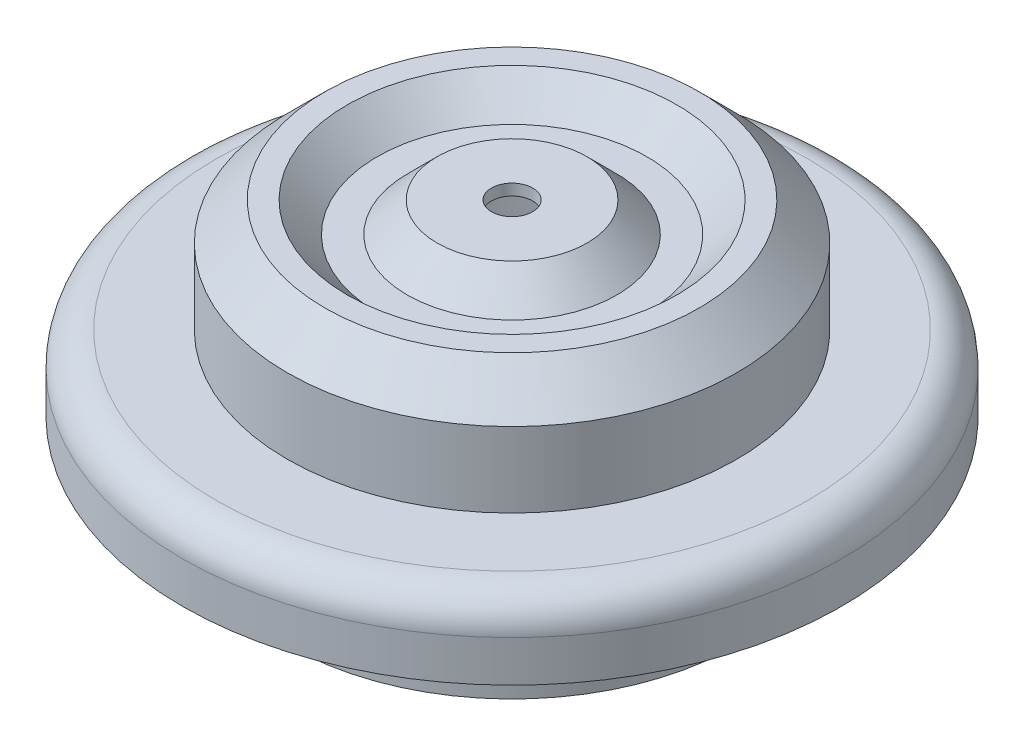
ISO-10303-21;
HEADER;
FILE_DESCRIPTION(('STEP AP214'),'2;1');
FILE_NAME('part.step','',(''),(''),'','','');
FILE_SCHEMA(('AUTOMOTIVE_DESIGN { 1 0 10303 214 1 1 1 1 }'));
ENDSEC;
DATA;
#1=APPLICATION_CONTEXT('core data for automotive mechanical design processes');
#2=APPLICATION_PROTOCOL_DEFINITION('international standard','automotive_design',2000,#1);
#3=PRODUCT_CONTEXT('',#1,'mechanical');
#4=PRODUCT('Part','Part','',(#3));
#5=PRODUCT_RELATED_PRODUCT_CATEGORY('part','',(#4));
#6=PRODUCT_DEFINITION_FORMATION('','',#4);
#7=PRODUCT_DEFINITION_CONTEXT('part definition',#1,'design');
#8=PRODUCT_DEFINITION('design','',#6,#7);
#9=PRODUCT_DEFINITION_SHAPE('','',#8);
#10=(LENGTH_UNIT() NAMED_UNIT(*) SI_UNIT(.MILLI.,.METRE.));
#11=(NAMED_UNIT(*) PLANE_ANGLE_UNIT() SI_UNIT($,.RADIAN.));
#12=(NAMED_UNIT(*) SI_UNIT($,.STERADIAN.) SOLID_ANGLE_UNIT());
#13=UNCERTAINTY_MEASURE_WITH_UNIT(LENGTH_MEASURE(1.E-05),#10,'distance_accuracy_value','');
#14=(GEOMETRIC_REPRESENTATION_CONTEXT(3) GLOBAL_UNCERTAINTY_ASSIGNED_CONTEXT((#13)) GLOBAL_UNIT_ASSIGNED_CONTEXT((#10,
#11,#12)) REPRESENTATION_CONTEXT('',''));
#15=CARTESIAN_POINT('',(0.,0.,0.));
#16=DIRECTION('',(0.,0.,1.));
#17=DIRECTION('',(1.,0.,0.));
#18=AXIS2_PLACEMENT_3D('',#15,#16,#17);
#19=CARTESIAN_POINT('',(28.5,-16.5,0.));
#20=DIRECTION('',(0.,1.,0.));
#21=DIRECTION('',(0.,0.,1.));
#22=AXIS2_PLACEMENT_3D('',#19,#20,#21);
#23=PLANE('',#22);
#24=CARTESIAN_POINT('',(0.,-16.5,0.));
#25=DIRECTION('',(0.,1.,0.));
#26=DIRECTION('',(0.,0.,1.));
#27=AXIS2_PLACEMENT_3D('',#24,#25,#26);
#28=CIRCLE('',#27,39.5);
#29=CARTESIAN_POINT('',(0.,-16.5,39.5));
#30=VERTEX_POINT('',#29);
#31=EDGE_CURVE('E84',#30,#30,#28,.T.);
#32=ORIENTED_EDGE('',*,*,#31,.F.);
#33=EDGE_LOOP('',(#32));
#34=FACE_BOUND('',#33,.T.);
#35=CARTESIAN_POINT('',(0.,-16.5,0.));
#36=DIRECTION('',(0.,1.,0.));
#37=DIRECTION('',(0.,0.,1.));
#38=AXIS2_PLACEMENT_3D('',#35,#36,#37);
#39=CIRCLE('',#38,30.);
#40=CARTESIAN_POINT('',(0.,-16.5,30.));
#41=VERTEX_POINT('',#40);
#42=EDGE_CURVE('E10',#41,#41,#39,.F.);
#43=ORIENTED_EDGE('',*,*,#42,.F.);
#44=EDGE_LOOP('',(#43));
#45=FACE_BOUND('',#44,.T.);
#46=ADVANCED_FACE('F32',(#34,#45),#23,.F.);
#47=CARTESIAN_POINT('',(0.,0.,0.));
#48=DIRECTION('',(0.,-1.,0.));
#49=DIRECTION('',(0.,0.,-1.));
#50=AXIS2_PLACEMENT_3D('',#47,#48,#49);
#51=PLANE('',#50);
#52=CARTESIAN_POINT('',(0.,0.,0.));
#53=DIRECTION('',(0.,1.,0.));
#54=DIRECTION('',(0.,0.,1.));
#55=AXIS2_PLACEMENT_3D('',#52,#53,#54);
#56=CIRCLE('',#55,2.75);
#57=CARTESIAN_POINT('',(0.,0.,2.75));
#58=VERTEX_POINT('',#57);
#59=EDGE_CURVE('E54',#58,#58,#56,.T.);
#60=ORIENTED_EDGE('',*,*,#59,.F.);
#61=EDGE_LOOP('',(#60));
#62=FACE_BOUND('',#61,.T.);
#63=CARTESIAN_POINT('',(0.,0.,0.));
#64=DIRECTION('',(0.,1.,0.));
#65=DIRECTION('',(0.,0.,1.));
#66=AXIS2_PLACEMENT_3D('',#63,#64,#65);
#67=CIRCLE('',#66,10.);
#68=CARTESIAN_POINT('',(0.,0.,10.));
#69=VERTEX_POINT('',#68);
#70=EDGE_CURVE('E39',#69,#69,#67,.T.);
#71=ORIENTED_EDGE('',*,*,#70,.T.);
#72=EDGE_LOOP('',(#71));
#73=FACE_BOUND('',#72,.T.);
#74=ADVANCED_FACE('F34',(#62,#73),#51,.F.);
#75=CARTESIAN_POINT('',(0.,-4.,0.));
#76=DIRECTION('',(0.,-1.,0.));
#77=DIRECTION('',(0.,0.,-1.));
#78=AXIS2_PLACEMENT_3D('',#75,#76,#77);
#79=CONICAL_SURFACE('',#78,14.,0.785398163397448);
#80=ORIENTED_EDGE('',*,*,#70,.F.);
#81=EDGE_LOOP('',(#80));
#82=FACE_BOUND('',#81,.T.);
#83=CARTESIAN_POINT('',(0.,-4.,0.));
#84=DIRECTION('',(0.,1.,0.));
#85=DIRECTION('',(0.,0.,1.));
#86=AXIS2_PLACEMENT_3D('',#83,#84,#85);
#87=CIRCLE('',#86,14.);
#88=CARTESIAN_POINT('',(0.,-4.,14.));
#89=VERTEX_POINT('',#88);
#90=EDGE_CURVE('E43',#89,#89,#87,.T.);
#91=ORIENTED_EDGE('',*,*,#90,.T.);
#92=EDGE_LOOP('',(#91));
#93=FACE_BOUND('',#92,.T.);
#94=ADVANCED_FACE('F185',(#82,#93),#79,.T.);
#95=CARTESIAN_POINT('',(14.,-4.,0.));
#96=DIRECTION('',(0.,-1.,0.));
#97=DIRECTION('',(0.,0.,-1.));
#98=AXIS2_PLACEMENT_3D('',#95,#96,#97);
#99=PLANE('',#98);
#100=ORIENTED_EDGE('',*,*,#90,.F.);
#101=EDGE_LOOP('',(#100));
#102=FACE_BOUND('',#101,.T.);
#103=CARTESIAN_POINT('',(0.,-4.,0.));
#104=DIRECTION('',(0.,1.,0.));
#105=DIRECTION('',(0.,0.,1.));
#106=AXIS2_PLACEMENT_3D('',#103,#104,#105);
#107=CIRCLE('',#106,18.);
#108=CARTESIAN_POINT('',(0.,-4.,18.));
#109=VERTEX_POINT('',#108);
#110=EDGE_CURVE('E48',#109,#109,#107,.T.);
#111=ORIENTED_EDGE('',*,*,#110,.T.);
#112=EDGE_LOOP('',(#111));
#113=FACE_BOUND('',#112,.T.);
#114=ADVANCED_FACE('F116',(#102,#113),#99,.F.);
#115=CARTESIAN_POINT('',(0.,0.,0.));
#116=DIRECTION('',(0.,1.,0.));
#117=DIRECTION('',(0.,0.,1.));
#118=AXIS2_PLACEMENT_3D('',#115,#116,#117);
#119=CONICAL_SURFACE('',#118,22.,0.785398163397448);
#120=ORIENTED_EDGE('',*,*,#110,.F.);
#121=EDGE_LOOP('',(#120));
#122=FACE_BOUND('',#121,.T.);
#123=CARTESIAN_POINT('',(0.,0.,0.));
#124=DIRECTION('',(0.,1.,0.));
#125=DIRECTION('',(0.,0.,1.));
#126=AXIS2_PLACEMENT_3D('',#123,#124,#125);
#127=CIRCLE('',#126,22.);
#128=CARTESIAN_POINT('',(0.,0.,22.));
#129=VERTEX_POINT('',#128);
#130=EDGE_CURVE('E111',#129,#129,#127,.T.);
#131=ORIENTED_EDGE('',*,*,#130,.T.);
#132=EDGE_LOOP('',(#131));
#133=FACE_BOUND('',#132,.T.);
#134=ADVANCED_FACE('F118',(#122,#133),#119,.F.);
#135=CARTESIAN_POINT('',(22.,0.,0.));
#136=DIRECTION('',(0.,-1.,0.));
#137=DIRECTION('',(0.,0.,-1.));
#138=AXIS2_PLACEMENT_3D('',#135,#136,#137);
#139=PLANE('',#138);
#140=ORIENTED_EDGE('',*,*,#130,.F.);
#141=EDGE_LOOP('',(#140));
#142=FACE_BOUND('',#141,.T.);
#143=CARTESIAN_POINT('',(0.,0.,0.));
#144=DIRECTION('',(0.,1.,0.));
#145=DIRECTION('',(0.,0.,1.));
#146=AXIS2_PLACEMENT_3D('',#143,#144,#145);
#147=CIRCLE('',#146,25.);
#148=CARTESIAN_POINT('',(0.,0.,25.));
#149=VERTEX_POINT('',#148);
#150=EDGE_CURVE('E108',#149,#149,#147,.T.);
#151=ORIENTED_EDGE('',*,*,#150,.T.);
#152=EDGE_LOOP('',(#151));
#153=FACE_BOUND('',#152,.T.);
#154=ADVANCED_FACE('F121',(#142,#153),#139,.F.);
#155=CARTESIAN_POINT('',(0.,-5.00000000000001,0.));
#156=DIRECTION('',(0.,-1.,0.));
#157=DIRECTION('',(0.,0.,-1.));
#158=AXIS2_PLACEMENT_3D('',#155,#156,#157);
#159=CONICAL_SURFACE('',#158,30.,0.785398163397447);
#160=ORIENTED_EDGE('',*,*,#150,.F.);
#161=EDGE_LOOP('',(#160));
#162=FACE_BOUND('',#161,.T.);
#163=CARTESIAN_POINT('',(0.,-5.00000000000001,0.));
#164=DIRECTION('',(0.,1.,0.));
#165=DIRECTION('',(0.,0.,1.));
#166=AXIS2_PLACEMENT_3D('',#163,#164,#165);
#167=CIRCLE('',#166,30.);
#168=CARTESIAN_POINT('',(0.,-5.00000000000001,30.));
#169=VERTEX_POINT('',#168);
#170=EDGE_CURVE('E105',#169,#169,#167,.T.);
#171=ORIENTED_EDGE('',*,*,#170,.T.);
#172=EDGE_LOOP('',(#171));
#173=FACE_BOUND('',#172,.T.);
#174=ADVANCED_FACE('F127',(#162,#173),#159,.T.);
#175=CARTESIAN_POINT('',(0.,0.,0.));
#176=DIRECTION('',(0.,1.,0.));
#177=DIRECTION('',(0.,0.,1.));
#178=AXIS2_PLACEMENT_3D('',#175,#176,#177);
#179=CYLINDRICAL_SURFACE('',#178,30.);
#180=ORIENTED_EDGE('',*,*,#170,.F.);
#181=EDGE_LOOP('',(#180));
#182=FACE_BOUND('',#181,.T.);
#183=CARTESIAN_POINT('',(0.,-15.,0.));
#184=DIRECTION('',(0.,1.,0.));
#185=DIRECTION('',(0.,0.,1.));
#186=AXIS2_PLACEMENT_3D('',#183,#184,#185);
#187=CIRCLE('',#186,30.);
#188=CARTESIAN_POINT('',(0.,-15.,30.));
#189=VERTEX_POINT('',#188);
#190=EDGE_CURVE('E102',#189,#189,#187,.T.);
#191=ORIENTED_EDGE('',*,*,#190,.T.);
#192=EDGE_LOOP('',(#191));
#193=FACE_BOUND('',#192,.T.);
#194=ADVANCED_FACE('F133',(#182,#193),#179,.T.);
#195=CARTESIAN_POINT('',(30.,-15.,0.));
#196=DIRECTION('',(0.,-1.,0.));
#197=DIRECTION('',(0.,0.,-1.));
#198=AXIS2_PLACEMENT_3D('',#195,#196,#197);
#199=PLANE('',#198);
#200=ORIENTED_EDGE('',*,*,#190,.F.);
#201=EDGE_LOOP('',(#200));
#202=FACE_BOUND('',#201,.T.);
#203=CARTESIAN_POINT('',(0.,-15.,0.));
#204=DIRECTION('',(0.,1.,0.));
#205=DIRECTION('',(0.,0.,1.));
#206=AXIS2_PLACEMENT_3D('',#203,#204,#205);
#207=CIRCLE('',#206,39.5);
#208=CARTESIAN_POINT('',(0.,-15.,39.5));
#209=VERTEX_POINT('',#208);
#210=EDGE_CURVE('E99',#209,#209,#207,.T.);
#211=ORIENTED_EDGE('',*,*,#210,.T.);
#212=EDGE_LOOP('',(#211));
#213=FACE_BOUND('',#212,.T.);
#214=ADVANCED_FACE('F139',(#202,#213),#199,.F.);
#215=CARTESIAN_POINT('',(0.,-19.5,0.));
#216=DIRECTION('',(0.,1.,0.));
#217=DIRECTION('',(0.,0.,1.));
#218=AXIS2_PLACEMENT_3D('',#215,#216,#217);
#219=TOROIDAL_SURFACE('',#218,39.5,4.5);
#220=ORIENTED_EDGE('',*,*,#210,.F.);
#221=EDGE_LOOP('',(#220));
#222=FACE_BOUND('',#221,.T.);
#223=CARTESIAN_POINT('',(0.,-19.5,0.));
#224=DIRECTION('',(0.,1.,0.));
#225=DIRECTION('',(0.,0.,1.));
#226=AXIS2_PLACEMENT_3D('',#223,#224,#225);
#227=CIRCLE('',#226,44.);
#228=CARTESIAN_POINT('',(0.,-19.5,44.));
#229=VERTEX_POINT('',#228);
#230=EDGE_CURVE('E96',#229,#229,#227,.T.);
#231=ORIENTED_EDGE('',*,*,#230,.T.);
#232=EDGE_LOOP('',(#231));
#233=FACE_BOUND('',#232,.T.);
#234=ADVANCED_FACE('F145',(#222,#233),#219,.T.);
#235=CARTESIAN_POINT('',(0.,0.,0.));
#236=DIRECTION('',(0.,1.,0.));
#237=DIRECTION('',(0.,0.,1.));
#238=AXIS2_PLACEMENT_3D('',#235,#236,#237);
#239=CYLINDRICAL_SURFACE('',#238,44.);
#240=ORIENTED_EDGE('',*,*,#230,.F.);
#241=EDGE_LOOP('',(#240));
#242=FACE_BOUND('',#241,.T.);
#243=CARTESIAN_POINT('',(0.,-25.,0.));
#244=DIRECTION('',(0.,1.,0.));
#245=DIRECTION('',(0.,0.,1.));
#246=AXIS2_PLACEMENT_3D('',#243,#244,#245);
#247=CIRCLE('',#246,44.);
#248=CARTESIAN_POINT('',(0.,-25.,44.));
#249=VERTEX_POINT('',#248);
#250=EDGE_CURVE('E93',#249,#249,#247,.T.);
#251=ORIENTED_EDGE('',*,*,#250,.T.);
#252=EDGE_LOOP('',(#251));
#253=FACE_BOUND('',#252,.T.);
#254=ADVANCED_FACE('F151',(#242,#253),#239,.T.);
#255=CARTESIAN_POINT('',(42.5,-25.,0.));
#256=DIRECTION('',(0.,1.,0.));
#257=DIRECTION('',(0.,0.,1.));
#258=AXIS2_PLACEMENT_3D('',#255,#256,#257);
#259=PLANE('',#258);
#260=ORIENTED_EDGE('',*,*,#250,.F.);
#261=EDGE_LOOP('',(#260));
#262=FACE_BOUND('',#261,.T.);
#263=CARTESIAN_POINT('',(0.,-25.,0.));
#264=DIRECTION('',(0.,1.,0.));
#265=DIRECTION('',(0.,0.,1.));
#266=AXIS2_PLACEMENT_3D('',#263,#264,#265);
#267=CIRCLE('',#266,42.5);
#268=CARTESIAN_POINT('',(0.,-25.,42.5));
#269=VERTEX_POINT('',#268);
#270=EDGE_CURVE('E90',#269,#269,#267,.T.);
#271=ORIENTED_EDGE('',*,*,#270,.T.);
#272=EDGE_LOOP('',(#271));
#273=FACE_BOUND('',#272,.T.);
#274=ADVANCED_FACE('F157',(#262,#273),#259,.F.);
#275=CARTESIAN_POINT('',(0.,0.,0.));
#276=DIRECTION('',(0.,1.,0.));
#277=DIRECTION('',(0.,0.,1.));
#278=AXIS2_PLACEMENT_3D('',#275,#276,#277);
#279=CYLINDRICAL_SURFACE('',#278,42.5);
#280=ORIENTED_EDGE('',*,*,#270,.F.);
#281=EDGE_LOOP('',(#280));
#282=FACE_BOUND('',#281,.T.);
#283=CARTESIAN_POINT('',(0.,-19.5,0.));
#284=DIRECTION('',(0.,1.,0.));
#285=DIRECTION('',(0.,0.,1.));
#286=AXIS2_PLACEMENT_3D('',#283,#284,#285);
#287=CIRCLE('',#286,42.5);
#288=CARTESIAN_POINT('',(0.,-19.5,42.5));
#289=VERTEX_POINT('',#288);
#290=EDGE_CURVE('E87',#289,#289,#287,.T.);
#291=ORIENTED_EDGE('',*,*,#290,.T.);
#292=EDGE_LOOP('',(#291));
#293=FACE_BOUND('',#292,.T.);
#294=ADVANCED_FACE('F163',(#282,#293),#279,.F.);
#295=CARTESIAN_POINT('',(0.,-19.5,0.));
#296=DIRECTION('',(0.,1.,0.));
#297=DIRECTION('',(0.,0.,1.));
#298=AXIS2_PLACEMENT_3D('',#295,#296,#297);
#299=TOROIDAL_SURFACE('',#298,39.5,3.);
#300=ORIENTED_EDGE('',*,*,#290,.F.);
#301=EDGE_LOOP('',(#300));
#302=FACE_BOUND('',#301,.T.);
#303=ORIENTED_EDGE('',*,*,#31,.T.);
#304=EDGE_LOOP('',(#303));
#305=FACE_BOUND('',#304,.T.);
#306=ADVANCED_FACE('F169',(#302,#305),#299,.F.);
#307=CARTESIAN_POINT('',(0.,0.,0.));
#308=DIRECTION('',(0.,1.,0.));
#309=DIRECTION('',(0.,0.,1.));
#310=AXIS2_PLACEMENT_3D('',#307,#308,#309);
#311=CYLINDRICAL_SURFACE('',#310,28.5);
#312=CARTESIAN_POINT('',(0.,-5.62132034355964,0.));
#313=DIRECTION('',(0.,1.,0.));
#314=DIRECTION('',(0.,0.,1.));
#315=AXIS2_PLACEMENT_3D('',#312,#313,#314);
#316=CIRCLE('',#315,28.5);
#317=CARTESIAN_POINT('',(0.,-5.62132034355964,28.5));
#318=VERTEX_POINT('',#317);
#319=EDGE_CURVE('E81',#318,#318,#316,.T.);
#320=ORIENTED_EDGE('',*,*,#319,.T.);
#321=EDGE_LOOP('',(#320));
#322=FACE_BOUND('',#321,.T.);
#323=CARTESIAN_POINT('',(0.,-36.5,0.));
#324=DIRECTION('',(0.,-1.,0.));
#325=DIRECTION('',(0.,0.,-1.));
#326=AXIS2_PLACEMENT_3D('',#323,#324,#325);
#327=CIRCLE('',#326,28.5);
#328=CARTESIAN_POINT('',(0.,-36.5,-28.5));
#329=VERTEX_POINT('',#328);
#330=EDGE_CURVE('E66',#329,#329,#327,.T.);
#331=ORIENTED_EDGE('',*,*,#330,.T.);
#332=EDGE_LOOP('',(#331));
#333=FACE_BOUND('',#332,.T.);
#334=ADVANCED_FACE('F175',(#322,#333),#311,.F.);
#335=CARTESIAN_POINT('',(0.,-1.5,0.));
#336=DIRECTION('',(0.,-1.,0.));
#337=DIRECTION('',(0.,0.,-1.));
#338=AXIS2_PLACEMENT_3D('',#335,#336,#337);
#339=CONICAL_SURFACE('',#338,24.3786796564404,0.785398163397449);
#340=ORIENTED_EDGE('',*,*,#319,.F.);
#341=EDGE_LOOP('',(#340));
#342=FACE_BOUND('',#341,.T.);
#343=CARTESIAN_POINT('',(0.,-1.5,0.));
#344=DIRECTION('',(0.,1.,0.));
#345=DIRECTION('',(0.,0.,1.));
#346=AXIS2_PLACEMENT_3D('',#343,#344,#345);
#347=CIRCLE('',#346,24.3786796564404);
#348=CARTESIAN_POINT('',(0.,-1.5,24.3786796564404));
#349=VERTEX_POINT('',#348);
#350=EDGE_CURVE('E78',#349,#349,#347,.T.);
#351=ORIENTED_EDGE('',*,*,#350,.T.);
#352=EDGE_LOOP('',(#351));
#353=FACE_BOUND('',#352,.T.);
#354=ADVANCED_FACE('F250',(#342,#353),#339,.F.);
#355=CARTESIAN_POINT('',(22.6213203435596,-1.5,0.));
#356=DIRECTION('',(0.,1.,0.));
#357=DIRECTION('',(0.,0.,1.));
#358=AXIS2_PLACEMENT_3D('',#355,#356,#357);
#359=PLANE('',#358);
#360=ORIENTED_EDGE('',*,*,#350,.F.);
#361=EDGE_LOOP('',(#360));
#362=FACE_BOUND('',#361,.T.);
#363=CARTESIAN_POINT('',(0.,-1.5,0.));
#364=DIRECTION('',(0.,1.,0.));
#365=DIRECTION('',(0.,0.,1.));
#366=AXIS2_PLACEMENT_3D('',#363,#364,#365);
#367=CIRCLE('',#366,22.6213203435596);
#368=CARTESIAN_POINT('',(0.,-1.5,22.6213203435596));
#369=VERTEX_POINT('',#368);
#370=EDGE_CURVE('E75',#369,#369,#367,.T.);
#371=ORIENTED_EDGE('',*,*,#370,.T.);
#372=EDGE_LOOP('',(#371));
#373=FACE_BOUND('',#372,.T.);
#374=ADVANCED_FACE('F257',(#362,#373),#359,.F.);
#375=CARTESIAN_POINT('',(0.,-5.5,0.));
#376=DIRECTION('',(0.,1.,0.));
#377=DIRECTION('',(0.,0.,1.));
#378=AXIS2_PLACEMENT_3D('',#375,#376,#377);
#379=CONICAL_SURFACE('',#378,18.6213203435596,0.785398163397449);
#380=ORIENTED_EDGE('',*,*,#370,.F.);
#381=EDGE_LOOP('',(#380));
#382=FACE_BOUND('',#381,.T.);
#383=CARTESIAN_POINT('',(0.,-5.5,0.));
#384=DIRECTION('',(0.,1.,0.));
#385=DIRECTION('',(0.,0.,1.));
#386=AXIS2_PLACEMENT_3D('',#383,#384,#385);
#387=CIRCLE('',#386,18.6213203435596);
#388=CARTESIAN_POINT('',(0.,-5.5,18.6213203435596));
#389=VERTEX_POINT('',#388);
#390=EDGE_CURVE('E72',#389,#389,#387,.T.);
#391=ORIENTED_EDGE('',*,*,#390,.T.);
#392=EDGE_LOOP('',(#391));
#393=FACE_BOUND('',#392,.T.);
#394=ADVANCED_FACE('F264',(#382,#393),#379,.T.);
#395=CARTESIAN_POINT('',(13.3786796564404,-5.5,0.));
#396=DIRECTION('',(0.,1.,0.));
#397=DIRECTION('',(0.,0.,1.));
#398=AXIS2_PLACEMENT_3D('',#395,#396,#397);
#399=PLANE('',#398);
#400=ORIENTED_EDGE('',*,*,#390,.F.);
#401=EDGE_LOOP('',(#400));
#402=FACE_BOUND('',#401,.T.);
#403=CARTESIAN_POINT('',(0.,-5.5,0.));
#404=DIRECTION('',(0.,1.,0.));
#405=DIRECTION('',(0.,0.,1.));
#406=AXIS2_PLACEMENT_3D('',#403,#404,#405);
#407=CIRCLE('',#406,13.3786796564404);
#408=CARTESIAN_POINT('',(0.,-5.5,13.3786796564404));
#409=VERTEX_POINT('',#408);
#410=EDGE_CURVE('E58',#409,#409,#407,.T.);
#411=ORIENTED_EDGE('',*,*,#410,.T.);
#412=EDGE_LOOP('',(#411));
#413=FACE_BOUND('',#412,.T.);
#414=ADVANCED_FACE('F272',(#402,#413),#399,.F.);
#415=CARTESIAN_POINT('',(0.,-1.5,0.));
#416=DIRECTION('',(0.,-1.,0.));
#417=DIRECTION('',(0.,0.,-1.));
#418=AXIS2_PLACEMENT_3D('',#415,#416,#417);
#419=CONICAL_SURFACE('',#418,9.37867965644036,0.785398163397448);
#420=ORIENTED_EDGE('',*,*,#410,.F.);
#421=EDGE_LOOP('',(#420));
#422=FACE_BOUND('',#421,.T.);
#423=CARTESIAN_POINT('',(0.,-1.5,0.));
#424=DIRECTION('',(0.,1.,0.));
#425=DIRECTION('',(0.,0.,1.));
#426=AXIS2_PLACEMENT_3D('',#423,#424,#425);
#427=CIRCLE('',#426,9.37867965644036);
#428=CARTESIAN_POINT('',(0.,-1.5,9.37867965644036));
#429=VERTEX_POINT('',#428);
#430=EDGE_CURVE('E53',#429,#429,#427,.T.);
#431=ORIENTED_EDGE('',*,*,#430,.T.);
#432=EDGE_LOOP('',(#431));
#433=FACE_BOUND('',#432,.T.);
#434=ADVANCED_FACE('F280',(#422,#433),#419,.F.);
#435=CARTESIAN_POINT('',(0.,-1.5,0.));
#436=DIRECTION('',(0.,1.,0.));
#437=DIRECTION('',(0.,0.,1.));
#438=AXIS2_PLACEMENT_3D('',#435,#436,#437);
#439=PLANE('',#438);
#440=CARTESIAN_POINT('',(0.,-1.5,0.));
#441=DIRECTION('',(0.,1.,0.));
#442=DIRECTION('',(0.,0.,1.));
#443=AXIS2_PLACEMENT_3D('',#440,#441,#442);
#444=CIRCLE('',#443,2.75);
#445=CARTESIAN_POINT('',(0.,-1.5,2.75));
#446=VERTEX_POINT('',#445);
#447=EDGE_CURVE('E51',#446,#446,#444,.T.);
#448=ORIENTED_EDGE('',*,*,#447,.T.);
#449=EDGE_LOOP('',(#448));
#450=FACE_BOUND('',#449,.T.);
#451=ORIENTED_EDGE('',*,*,#430,.F.);
#452=EDGE_LOOP('',(#451));
#453=FACE_BOUND('',#452,.T.);
#454=ADVANCED_FACE('F288',(#450,#453),#439,.F.);
#455=CARTESIAN_POINT('',(0.,-25.,0.));
#456=DIRECTION('',(0.,1.,0.));
#457=DIRECTION('',(0.,0.,1.));
#458=AXIS2_PLACEMENT_3D('',#455,#456,#457);
#459=CYLINDRICAL_SURFACE('',#458,2.75);
#460=ORIENTED_EDGE('',*,*,#59,.T.);
#461=EDGE_LOOP('',(#460));
#462=FACE_BOUND('',#461,.T.);
#463=ORIENTED_EDGE('',*,*,#447,.F.);
#464=EDGE_LOOP('',(#463));
#465=FACE_BOUND('',#464,.T.);
#466=ADVANCED_FACE('F296',(#462,#465),#459,.F.);
#467=CARTESIAN_POINT('',(0.,-36.5,0.));
#468=DIRECTION('',(0.,-1.,0.));
#469=DIRECTION('',(0.,0.,-1.));
#470=AXIS2_PLACEMENT_3D('',#467,#468,#469);
#471=PLANE('',#470);
#472=CARTESIAN_POINT('',(0.,-36.5,0.));
#473=DIRECTION('',(0.,-1.,0.));
#474=DIRECTION('',(0.,0.,-1.));
#475=AXIS2_PLACEMENT_3D('',#472,#473,#474);
#476=CIRCLE('',#475,30.);
#477=CARTESIAN_POINT('',(0.,-36.5,-30.));
#478=VERTEX_POINT('',#477);
#479=EDGE_CURVE('E61',#478,#478,#476,.T.);
#480=ORIENTED_EDGE('',*,*,#479,.T.);
#481=EDGE_LOOP('',(#480));
#482=FACE_BOUND('',#481,.T.);
#483=ORIENTED_EDGE('',*,*,#330,.F.);
#484=EDGE_LOOP('',(#483));
#485=FACE_BOUND('',#484,.T.);
#486=ADVANCED_FACE('F303',(#482,#485),#471,.T.);
#487=CARTESIAN_POINT('',(0.,-36.5,0.));
#488=DIRECTION('',(0.,1.,0.));
#489=DIRECTION('',(0.,0.,1.));
#490=AXIS2_PLACEMENT_3D('',#487,#488,#489);
#491=CYLINDRICAL_SURFACE('',#490,30.);
#492=ORIENTED_EDGE('',*,*,#479,.F.);
#493=EDGE_LOOP('',(#492));
#494=FACE_BOUND('',#493,.T.);
#495=ORIENTED_EDGE('',*,*,#42,.T.);
#496=EDGE_LOOP('',(#495));
#497=FACE_BOUND('',#496,.T.);
#498=ADVANCED_FACE('F310',(#494,#497),#491,.T.);
#499=CLOSED_SHELL('',(#46,#74,#94,#114,#134,#154,#174,#194,#214,#234,#254,#274,#294,#306,#334,
#354,#374,#394,#414,#434,#454,#466,#486,#498));
#500=MANIFOLD_SOLID_BREP('B2',#499);
#501=ADVANCED_BREP_SHAPE_REPRESENTATION('',(#18,#500),#14);
#502=SHAPE_DEFINITION_REPRESENTATION(#9,#501);
ENDSEC;
END-ISO-10303-21;
